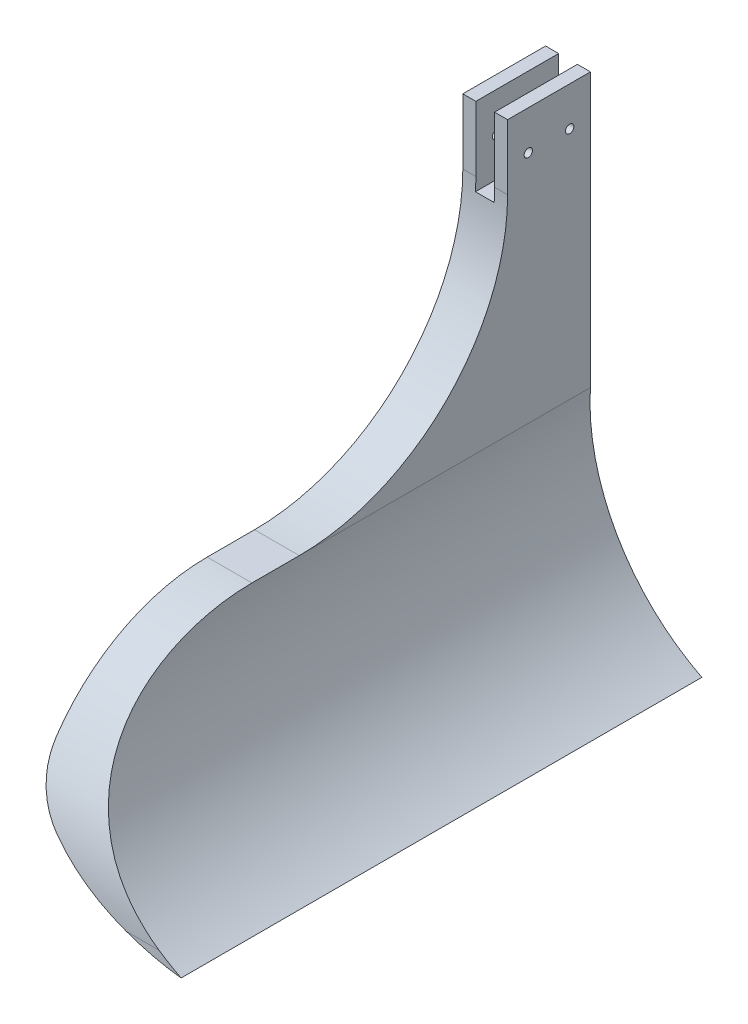
ISO-10303-21;
HEADER;
FILE_DESCRIPTION(('STEP AP214'),'2;1');
FILE_NAME('part.step','',(''),(''),'','','');
FILE_SCHEMA(('AUTOMOTIVE_DESIGN { 1 0 10303 214 1 1 1 1 }'));
ENDSEC;
DATA;
#1=APPLICATION_CONTEXT('core data for automotive mechanical design processes');
#2=APPLICATION_PROTOCOL_DEFINITION('international standard','automotive_design',2000,#1);
#3=PRODUCT_CONTEXT('',#1,'mechanical');
#4=PRODUCT('Part','Part','',(#3));
#5=PRODUCT_RELATED_PRODUCT_CATEGORY('part','',(#4));
#6=PRODUCT_DEFINITION_FORMATION('','',#4);
#7=PRODUCT_DEFINITION_CONTEXT('part definition',#1,'design');
#8=PRODUCT_DEFINITION('design','',#6,#7);
#9=PRODUCT_DEFINITION_SHAPE('','',#8);
#10=(LENGTH_UNIT() NAMED_UNIT(*) SI_UNIT(.MILLI.,.METRE.));
#11=(NAMED_UNIT(*) PLANE_ANGLE_UNIT() SI_UNIT($,.RADIAN.));
#12=(NAMED_UNIT(*) SI_UNIT($,.STERADIAN.) SOLID_ANGLE_UNIT());
#13=UNCERTAINTY_MEASURE_WITH_UNIT(LENGTH_MEASURE(1.E-05),#10,'distance_accuracy_value','');
#14=(GEOMETRIC_REPRESENTATION_CONTEXT(3) GLOBAL_UNCERTAINTY_ASSIGNED_CONTEXT((#13)) GLOBAL_UNIT_ASSIGNED_CONTEXT((#10,
#11,#12)) REPRESENTATION_CONTEXT('',''));
#15=CARTESIAN_POINT('',(0.,0.,0.));
#16=DIRECTION('',(0.,0.,1.));
#17=DIRECTION('',(1.,0.,0.));
#18=AXIS2_PLACEMENT_3D('',#15,#16,#17);
#19=CARTESIAN_POINT('',(0.,0.,31.8));
#20=DIRECTION('',(0.,0.,1.));
#21=DIRECTION('',(1.,0.,0.));
#22=AXIS2_PLACEMENT_3D('',#19,#20,#21);
#23=PLANE('',#22);
#24=DIRECTION('',(0.,1.,0.));
#25=VECTOR('',#24,1.);
#26=CARTESIAN_POINT('',(-30.,0.,31.8));
#27=LINE('',#26,#25);
#28=CARTESIAN_POINT('',(-30.,80.,31.8));
#29=VERTEX_POINT('',#28);
#30=CARTESIAN_POINT('',(-30.,105.,31.8));
#31=VERTEX_POINT('',#30);
#32=EDGE_CURVE('E232',#29,#31,#27,.T.);
#33=ORIENTED_EDGE('',*,*,#32,.F.);
#34=DIRECTION('',(1.,0.,0.));
#35=VECTOR('',#34,1.);
#36=CARTESIAN_POINT('',(-12.8,80.,31.8));
#37=LINE('',#36,#35);
#38=CARTESIAN_POINT('',(-25.,80.,31.8));
#39=VERTEX_POINT('',#38);
#40=EDGE_CURVE('E293',#29,#39,#37,.T.);
#41=ORIENTED_EDGE('',*,*,#40,.T.);
#42=DIRECTION('',(0.,-1.,0.));
#43=VECTOR('',#42,1.);
#44=CARTESIAN_POINT('',(-25.,0.,31.8));
#45=LINE('',#44,#43);
#46=CARTESIAN_POINT('',(-25.,105.,31.8));
#47=VERTEX_POINT('',#46);
#48=EDGE_CURVE('E244',#47,#39,#45,.T.);
#49=ORIENTED_EDGE('',*,*,#48,.F.);
#50=DIRECTION('',(1.,0.,0.));
#51=VECTOR('',#50,1.);
#52=CARTESIAN_POINT('',(0.,105.,31.8));
#53=LINE('',#52,#51);
#54=EDGE_CURVE('E247',#31,#47,#53,.T.);
#55=ORIENTED_EDGE('',*,*,#54,.F.);
#56=EDGE_LOOP('',(#33,#41,#49,#55));
#57=FACE_BOUND('',#56,.T.);
#58=ADVANCED_FACE('F41',(#57),#23,.T.);
#59=DIRECTION('',(0.,-1.,0.));
#60=VECTOR('',#59,1.);
#61=CARTESIAN_POINT('',(-17.8,0.,31.8));
#62=LINE('',#61,#60);
#63=CARTESIAN_POINT('',(-17.8,105.,31.8));
#64=VERTEX_POINT('',#63);
#65=CARTESIAN_POINT('',(-17.8,80.,31.8));
#66=VERTEX_POINT('',#65);
#67=EDGE_CURVE('E241',#64,#66,#62,.T.);
#68=ORIENTED_EDGE('',*,*,#67,.T.);
#69=DIRECTION('',(1.,0.,0.));
#70=VECTOR('',#69,1.);
#71=CARTESIAN_POINT('',(-12.8,80.,31.8));
#72=LINE('',#71,#70);
#73=CARTESIAN_POINT('',(-12.8,80.,31.8));
#74=VERTEX_POINT('',#73);
#75=EDGE_CURVE('E291',#66,#74,#72,.T.);
#76=ORIENTED_EDGE('',*,*,#75,.T.);
#77=DIRECTION('',(0.,-1.,0.));
#78=VECTOR('',#77,1.);
#79=CARTESIAN_POINT('',(-12.8,0.,31.8));
#80=LINE('',#79,#78);
#81=CARTESIAN_POINT('',(-12.8,105.,31.8));
#82=VERTEX_POINT('',#81);
#83=EDGE_CURVE('E234',#82,#74,#80,.T.);
#84=ORIENTED_EDGE('',*,*,#83,.F.);
#85=DIRECTION('',(1.,0.,0.));
#86=VECTOR('',#85,1.);
#87=CARTESIAN_POINT('',(0.,105.,31.8));
#88=LINE('',#87,#86);
#89=EDGE_CURVE('E238',#64,#82,#88,.T.);
#90=ORIENTED_EDGE('',*,*,#89,.F.);
#91=EDGE_LOOP('',(#68,#76,#84,#90));
#92=FACE_BOUND('',#91,.T.);
#93=ADVANCED_FACE('F378',(#92),#23,.T.);
#94=CARTESIAN_POINT('',(-30.,0.,31.8));
#95=DIRECTION('',(-1.,0.,0.));
#96=DIRECTION('',(0.,-1.,0.));
#97=AXIS2_PLACEMENT_3D('',#94,#95,#96);
#98=PLANE('',#97);
#99=CARTESIAN_POINT('',(-30.,90.,7.95));
#100=DIRECTION('',(1.,0.,0.));
#101=DIRECTION('',(0.,0.,1.));
#102=AXIS2_PLACEMENT_3D('',#99,#100,#101);
#103=CIRCLE('',#102,1.6);
#104=CARTESIAN_POINT('',(-30.,90.,9.55));
#105=VERTEX_POINT('',#104);
#106=EDGE_CURVE('E195',#105,#105,#103,.T.);
#107=ORIENTED_EDGE('',*,*,#106,.T.);
#108=EDGE_LOOP('',(#107));
#109=FACE_BOUND('',#108,.T.);
#110=CARTESIAN_POINT('',(-30.,90.,23.85));
#111=DIRECTION('',(1.,0.,0.));
#112=DIRECTION('',(0.,0.,-1.));
#113=AXIS2_PLACEMENT_3D('',#110,#111,#112);
#114=CIRCLE('',#113,1.6);
#115=CARTESIAN_POINT('',(-30.,90.,22.25));
#116=VERTEX_POINT('',#115);
#117=EDGE_CURVE('E183',#116,#116,#114,.T.);
#118=ORIENTED_EDGE('',*,*,#117,.T.);
#119=EDGE_LOOP('',(#118));
#120=FACE_BOUND('',#119,.T.);
#121=DIRECTION('',(0.,0.,1.));
#122=VECTOR('',#121,1.);
#123=CARTESIAN_POINT('',(-30.,-30.4818047918599,200.));
#124=LINE('',#123,#122);
#125=CARTESIAN_POINT('',(-30.,-30.4818047918599,0.));
#126=VERTEX_POINT('',#125);
#127=CARTESIAN_POINT('',(-30.,-30.4818047918599,187.778129491109));
#128=VERTEX_POINT('',#127);
#129=EDGE_CURVE('E316',#126,#128,#124,.T.);
#130=ORIENTED_EDGE('',*,*,#129,.T.);
#131=CARTESIAN_POINT('',(-30.0000000000001,-70.,130.));
#132=DIRECTION('',(-1.,0.,0.));
#133=DIRECTION('',(0.,-1.,0.));
#134=AXIS2_PLACEMENT_3D('',#131,#132,#133);
#135=CIRCLE('',#134,70.);
#136=CARTESIAN_POINT('',(-30.,0.,130.));
#137=VERTEX_POINT('',#136);
#138=EDGE_CURVE('E358',#128,#137,#135,.T.);
#139=ORIENTED_EDGE('',*,*,#138,.T.);
#140=DIRECTION('',(0.,0.,-1.));
#141=VECTOR('',#140,1.);
#142=CARTESIAN_POINT('',(-30.,0.,200.));
#143=LINE('',#142,#141);
#144=CARTESIAN_POINT('',(-30.,0.,111.8));
#145=VERTEX_POINT('',#144);
#146=EDGE_CURVE('E227',#137,#145,#143,.T.);
#147=ORIENTED_EDGE('',*,*,#146,.T.);
#148=CARTESIAN_POINT('',(-30.,80.,111.8));
#149=DIRECTION('',(-1.,0.,0.));
#150=DIRECTION('',(0.,-1.,0.));
#151=AXIS2_PLACEMENT_3D('',#148,#149,#150);
#152=CIRCLE('',#151,80.);
#153=EDGE_CURVE('E310',#145,#29,#152,.F.);
#154=ORIENTED_EDGE('',*,*,#153,.T.);
#155=ORIENTED_EDGE('',*,*,#32,.T.);
#156=DIRECTION('',(0.,0.,-1.));
#157=VECTOR('',#156,1.);
#158=CARTESIAN_POINT('',(-30.,105.,31.8));
#159=LINE('',#158,#157);
#160=CARTESIAN_POINT('',(-30.,105.,0.));
#161=VERTEX_POINT('',#160);
#162=EDGE_CURVE('E250',#31,#161,#159,.T.);
#163=ORIENTED_EDGE('',*,*,#162,.T.);
#164=DIRECTION('',(0.,1.,0.));
#165=VECTOR('',#164,1.);
#166=CARTESIAN_POINT('',(-30.,0.,0.));
#167=LINE('',#166,#165);
#168=EDGE_CURVE('E230',#126,#161,#167,.T.);
#169=ORIENTED_EDGE('',*,*,#168,.F.);
#170=EDGE_LOOP('',(#130,#139,#147,#154,#155,#163,#169));
#171=FACE_BOUND('',#170,.T.);
#172=ADVANCED_FACE('F343',(#109,#120,#171),#98,.T.);
#173=CARTESIAN_POINT('',(40.5018522884248,16.2007409153699,31.8));
#174=DIRECTION('',(0.,0.,-1.));
#175=DIRECTION('',(-1.,0.,0.));
#176=AXIS2_PLACEMENT_3D('',#173,#174,#175);
#177=CYLINDRICAL_SURFACE('',#176,91.803398874989);
#178=DIRECTION('',(0.,0.,-1.));
#179=VECTOR('',#178,1.);
#180=CARTESIAN_POINT('',(0.,-66.1853259054642,31.8));
#181=LINE('',#180,#179);
#182=CARTESIAN_POINT('',(0.,-66.1853259054642,160.893258265666));
#183=VERTEX_POINT('',#182);
#184=CARTESIAN_POINT('',(0.,-66.1853259054642,179.909808110345));
#185=VERTEX_POINT('',#184);
#186=EDGE_CURVE('E190',#183,#185,#181,.F.);
#187=ORIENTED_EDGE('',*,*,#186,.F.);
#188=CARTESIAN_POINT('',(40.5018522884248,16.2007409153699,160.893258265666));
#189=DIRECTION('',(0.,0.,-1.));
#190=DIRECTION('',(-1.,0.,0.));
#191=AXIS2_PLACEMENT_3D('',#188,#189,#190);
#192=CIRCLE('',#191,91.803398874989);
#193=CARTESIAN_POINT('',(-15.325484142754,-56.6770509831248,160.893258265666));
#194=VERTEX_POINT('',#193);
#195=EDGE_CURVE('E11',#183,#194,#192,.T.);
#196=ORIENTED_EDGE('',*,*,#195,.T.);
#197=CARTESIAN_POINT('',(40.5018522884248,16.2007409153699,15.1376744686769));
#198=DIRECTION('',(0.,0.894427190999916,0.447213595499958));
#199=DIRECTION('',(0.,0.447213595499958,-0.894427190999916));
#200=AXIS2_PLACEMENT_3D('',#197,#198,#199);
#201=ELLIPSE('',#200,205.278640450003,91.803398874989);
#202=EDGE_CURVE('E50',#194,#185,#201,.T.);
#203=ORIENTED_EDGE('',*,*,#202,.T.);
#204=EDGE_LOOP('',(#187,#196,#203));
#205=FACE_BOUND('',#204,.T.);
#206=CARTESIAN_POINT('',(40.5018522884248,16.2007409153699,21.8458784011762));
#207=DIRECTION('',(0.,-0.894427190999916,-0.447213595499958));
#208=DIRECTION('',(0.,0.447213595499958,-0.894427190999916));
#209=AXIS2_PLACEMENT_3D('',#206,#207,#208);
#210=ELLIPSE('',#209,205.278640450003,91.803398874989);
#211=CARTESIAN_POINT('',(0.,-66.1853259054642,186.618012042844));
#212=VERTEX_POINT('',#211);
#213=CARTESIAN_POINT('',(-17.4491488944943,-55.,164.247360231916));
#214=VERTEX_POINT('',#213);
#215=EDGE_CURVE('E452',#212,#214,#210,.T.);
#216=ORIENTED_EDGE('',*,*,#215,.T.);
#217=DIRECTION('',(0.,0.,-1.));
#218=VECTOR('',#217,1.);
#219=CARTESIAN_POINT('',(-17.4491488944943,-55.,31.8));
#220=LINE('',#219,#218);
#221=CARTESIAN_POINT('',(-17.4491488944943,-55.,190.893258265666));
#222=VERTEX_POINT('',#221);
#223=EDGE_CURVE('E457',#214,#222,#220,.F.);
#224=ORIENTED_EDGE('',*,*,#223,.T.);
#225=CARTESIAN_POINT('',(40.5018522884248,16.2007409153699,190.893258265666));
#226=DIRECTION('',(0.,0.,1.));
#227=DIRECTION('',(1.,0.,0.));
#228=AXIS2_PLACEMENT_3D('',#225,#226,#227);
#229=CIRCLE('',#228,91.803398874989);
#230=CARTESIAN_POINT('',(0.,-66.1853259054642,190.893258265666));
#231=VERTEX_POINT('',#230);
#232=EDGE_CURVE('E447',#222,#231,#229,.T.);
#233=ORIENTED_EDGE('',*,*,#232,.T.);
#234=DIRECTION('',(0.,0.,-1.));
#235=VECTOR('',#234,1.);
#236=CARTESIAN_POINT('',(0.,-66.1853259054642,31.8));
#237=LINE('',#236,#235);
#238=EDGE_CURVE('E445',#231,#212,#237,.T.);
#239=ORIENTED_EDGE('',*,*,#238,.T.);
#240=EDGE_LOOP('',(#216,#224,#233,#239));
#241=FACE_BOUND('',#240,.T.);
#242=CARTESIAN_POINT('',(40.5018522884248,16.2007409153699,200.));
#243=DIRECTION('',(0.,0.,1.));
#244=DIRECTION('',(1.,0.,0.));
#245=AXIS2_PLACEMENT_3D('',#242,#243,#244);
#246=CIRCLE('',#245,91.803398874989);
#247=CARTESIAN_POINT('',(8.92185370321916,-70.,200.));
#248=VERTEX_POINT('',#247);
#249=CARTESIAN_POINT('',(30.,-75.,200.));
#250=VERTEX_POINT('',#249);
#251=EDGE_CURVE('E225',#248,#250,#246,.T.);
#252=ORIENTED_EDGE('',*,*,#251,.F.);
#253=CARTESIAN_POINT('',(8.92185370321916,-70.,200.));
#254=CARTESIAN_POINT('',(8.26411347929146,-69.7590340717941,199.999996557121));
#255=CARTESIAN_POINT('',(7.60915491631928,-69.5105483306834,199.998756105011));
#256=CARTESIAN_POINT('',(6.3051005385999,-68.9986541052959,199.993306250773));
#257=CARTESIAN_POINT('',(5.65600478485099,-68.7352454659641,199.989096817792));
#258=CARTESIAN_POINT('',(3.71796967445498,-67.9228133991998,199.971272558723));
#259=CARTESIAN_POINT('',(2.43829432753717,-67.3515881678083,199.952461754739));
#260=CARTESIAN_POINT('',(-0.0808646972158559,-66.1572063567584,199.896972592429));
#261=CARTESIAN_POINT('',(-1.32061868494865,-65.5346107836442,199.860470339025));
#262=CARTESIAN_POINT('',(-3.77000210090307,-64.2342601642477,199.765186323071));
#263=CARTESIAN_POINT('',(-4.9796318632748,-63.556505730166,199.70640480777));
#264=CARTESIAN_POINT('',(-7.36616863705288,-62.1474395501762,199.561763915276));
#265=CARTESIAN_POINT('',(-8.54306534212335,-61.416111193555,199.475896112403));
#266=CARTESIAN_POINT('',(-10.8605794110915,-59.9023483642921,199.272077014389));
#267=CARTESIAN_POINT('',(-12.0011988308855,-59.1199167954588,199.154127541001));
#268=CARTESIAN_POINT('',(-14.2540933252477,-57.4986133623688,198.87958909915));
#269=CARTESIAN_POINT('',(-15.3659815239629,-56.6592638878951,198.722633109577));
#270=CARTESIAN_POINT('',(-17.0011786800007,-55.3656549531663,198.454582993224));
#271=CARTESIAN_POINT('',(-17.5408960161882,-54.9286090246824,198.35977765231));
#272=CARTESIAN_POINT('',(-18.6090291205779,-54.0434682881892,198.158602112912));
#273=CARTESIAN_POINT('',(-19.1374444600317,-53.5953730624011,198.05223147662));
#274=CARTESIAN_POINT('',(-19.6600120829999,-53.1419884825606,197.939733938822));
#275=B_SPLINE_CURVE_WITH_KNOTS('',3,(#253,#254,#255,#256,#257,#258,#259,#260,#261,#262,#263,
#264,#265,#266,#267,#268,#269,#270,#271,#272,#273,#274),.UNSPECIFIED.,.F.,.F.,(4,2,2,2,2,2,2,2,
2,2,4),(0.,2.10137287499703,4.20276758812977,8.40559486633036,12.5674196708921,16.7291982902267,
20.8922727846682,25.0551109285769,29.2587084386886,31.3612368974471,33.463844975971),.UNSPECIFIED.);
#276=CARTESIAN_POINT('',(-19.660012083,-53.1419884825606,197.939733938822));
#277=VERTEX_POINT('',#276);
#278=EDGE_CURVE('E346',#248,#277,#275,.T.);
#279=ORIENTED_EDGE('',*,*,#278,.T.);
#280=DIRECTION('',(0.,0.,-1.));
#281=VECTOR('',#280,1.);
#282=CARTESIAN_POINT('',(-19.660012083,-53.1419884825606,31.8));
#283=LINE('',#282,#281);
#284=CARTESIAN_POINT('',(-19.660012083,-53.1419884825606,0.));
#285=VERTEX_POINT('',#284);
#286=EDGE_CURVE('E312',#277,#285,#283,.T.);
#287=ORIENTED_EDGE('',*,*,#286,.T.);
#288=CARTESIAN_POINT('',(40.5018522884248,16.2007409153699,0.));
#289=DIRECTION('',(0.,0.,1.));
#290=DIRECTION('',(1.,0.,0.));
#291=AXIS2_PLACEMENT_3D('',#288,#289,#290);
#292=CIRCLE('',#291,91.803398874989);
#293=CARTESIAN_POINT('',(30.,-75.,0.));
#294=VERTEX_POINT('',#293);
#295=EDGE_CURVE('E252',#285,#294,#292,.T.);
#296=ORIENTED_EDGE('',*,*,#295,.T.);
#297=DIRECTION('',(0.,0.,-1.));
#298=VECTOR('',#297,1.);
#299=CARTESIAN_POINT('',(30.,-75.,31.8));
#300=LINE('',#299,#298);
#301=EDGE_CURVE('E288',#250,#294,#300,.T.);
#302=ORIENTED_EDGE('',*,*,#301,.F.);
#303=EDGE_LOOP('',(#252,#279,#287,#296,#302));
#304=FACE_BOUND('',#303,.T.);
#305=ADVANCED_FACE('F337',(#205,#241,#304),#177,.T.);
#306=CARTESIAN_POINT('',(65.6980576649736,-4.91604175918838,31.8));
#307=DIRECTION('',(0.,0.,-1.));
#308=DIRECTION('',(-1.,0.,0.));
#309=AXIS2_PLACEMENT_3D('',#306,#307,#308);
#310=CYLINDRICAL_SURFACE('',#309,78.6518437403193);
#311=DIRECTION('',(0.,0.,-1.));
#312=VECTOR('',#311,1.);
#313=CARTESIAN_POINT('',(-12.8,0.,200.));
#314=LINE('',#313,#312);
#315=CARTESIAN_POINT('',(-12.8,0.,130.));
#316=VERTEX_POINT('',#315);
#317=CARTESIAN_POINT('',(-12.8,0.,111.8));
#318=VERTEX_POINT('',#317);
#319=EDGE_CURVE('E228',#316,#318,#314,.T.);
#320=ORIENTED_EDGE('',*,*,#319,.F.);
#321=CARTESIAN_POINT('',(-12.8,0.,130.));
#322=CARTESIAN_POINT('',(-12.7999642052155,1.32345455669019E-05,130.98094729135));
#323=CARTESIAN_POINT('',(-12.8012901008779,-0.0206193070886854,131.961892960559));
#324=CARTESIAN_POINT('',(-12.8064078399143,-0.10308054150943,133.922039054772));
#325=CARTESIAN_POINT('',(-12.8101996682476,-0.164908983029099,134.901239490383));
#326=CARTESIAN_POINT('',(-12.8199915316035,-0.329661340319642,136.856102501738));
#327=CARTESIAN_POINT('',(-12.8259914251348,-0.432582622927384,137.831765300127));
#328=CARTESIAN_POINT('',(-12.8396924430125,-0.679333026045934,139.777891860139));
#329=CARTESIAN_POINT('',(-12.8473935675724,-0.823162151692727,140.74835562111));
#330=CARTESIAN_POINT('',(-12.8638184684743,-1.15158193864885,142.683006513837));
#331=CARTESIAN_POINT('',(-12.8725429113507,-1.33619923711572,143.647189118037));
#332=CARTESIAN_POINT('',(-12.8901362015666,-1.74581581673852,145.566940995437));
#333=CARTESIAN_POINT('',(-12.8990050495374,-1.97081527447156,146.522510230956));
#334=CARTESIAN_POINT('',(-12.9158367242898,-2.46079960482181,148.423347259794));
#335=CARTESIAN_POINT('',(-12.9237995534837,-2.72578437097588,149.368615080534));
#336=CARTESIAN_POINT('',(-12.9376006330794,-3.29527453695544,151.247186571631));
#337=CARTESIAN_POINT('',(-12.9434388834784,-3.59977993683442,152.18049024197));
#338=CARTESIAN_POINT('',(-12.9516171100602,-4.24798538026195,154.034083960523));
#339=CARTESIAN_POINT('',(-12.9539548115935,-4.59171075291293,154.954365162439));
#340=CARTESIAN_POINT('',(-12.953598374494,-5.31761526962595,156.779729437704));
#341=CARTESIAN_POINT('',(-12.9509037973953,-5.69979776173786,157.684811179779));
#342=CARTESIAN_POINT('',(-12.9388198943983,-6.50187184626557,159.477997962379));
#343=CARTESIAN_POINT('',(-12.9294309972237,-6.92176102233105,160.366104086332));
#344=CARTESIAN_POINT('',(-12.9021725554772,-7.79852359327602,162.123838410132));
#345=CARTESIAN_POINT('',(-12.884302272619,-8.25540020495931,162.993464994487));
#346=CARTESIAN_POINT('',(-12.8381948363613,-9.20503309027219,164.712181682612));
#347=CARTESIAN_POINT('',(-12.8099617614731,-9.69777518714552,165.561279725911));
#348=CARTESIAN_POINT('',(-12.7411414527228,-10.7182908646927,167.237640193839));
#349=CARTESIAN_POINT('',(-12.7005543474723,-11.2460640806306,168.064902845689));
#350=CARTESIAN_POINT('',(-12.6049609531509,-12.3355304447598,169.695979780155));
#351=CARTESIAN_POINT('',(-12.5499541463491,-12.8972248103128,170.499793219688));
#352=CARTESIAN_POINT('',(-12.4234087432706,-14.0531640085298,172.082198835525));
#353=CARTESIAN_POINT('',(-12.3518720097676,-14.6474051677109,172.860793842453));
#354=CARTESIAN_POINT('',(-12.1920437722545,-15.8524554175663,174.372915322861));
#355=CARTESIAN_POINT('',(-12.1041934550096,-16.4625293539679,175.107074148351));
#356=CARTESIAN_POINT('',(-11.9086905829031,-17.710733480593,176.548267763277));
#357=CARTESIAN_POINT('',(-11.8010404654614,-18.348860210076,177.255305878427));
#358=CARTESIAN_POINT('',(-11.5639356571324,-19.6515506920616,178.64090793562));
#359=CARTESIAN_POINT('',(-11.4344793993949,-20.3161163416736,179.319469827164));
#360=CARTESIAN_POINT('',(-11.1518321938311,-21.6696962583781,180.646619764897));
#361=CARTESIAN_POINT('',(-10.9986412898397,-22.3587104803153,181.295207866442));
#362=CARTESIAN_POINT('',(-10.6668499143928,-23.7582831361081,182.560370286155));
#363=CARTESIAN_POINT('',(-10.4882765034753,-24.4688179997998,183.176977755734));
#364=CARTESIAN_POINT('',(-10.1038723756982,-25.9097528843875,184.377656933986));
#365=CARTESIAN_POINT('',(-9.89804147436741,-26.6401530396997,184.961728422429));
#366=CARTESIAN_POINT('',(-9.45758268403362,-28.1181270265323,186.096135696885));
#367=CARTESIAN_POINT('',(-9.22295823794597,-28.8656987961282,186.646475504503));
#368=CARTESIAN_POINT('',(-8.72351918589893,-30.3752916580421,187.712531037096));
#369=CARTESIAN_POINT('',(-8.4587055543141,-31.137312283353,188.228247878695));
#370=CARTESIAN_POINT('',(-7.93001931109923,-32.584472773664,189.167003233628));
#371=CARTESIAN_POINT('',(-7.669544319307,-33.268370169632,189.593877807661));
#372=CARTESIAN_POINT('',(-7.12341517144908,-34.6430082659281,190.41958244135));
#373=CARTESIAN_POINT('',(-6.83776131712554,-35.3337488841593,190.818412836983));
#374=CARTESIAN_POINT('',(-6.24082257612842,-36.7198050399644,191.587798058142));
#375=CARTESIAN_POINT('',(-5.92953968663455,-37.4151202171811,191.958355082584));
#376=CARTESIAN_POINT('',(-5.28101495200494,-38.8081357225157,192.671203678839));
#377=CARTESIAN_POINT('',(-4.94377295444956,-39.5058360646151,193.013495084667));
#378=CARTESIAN_POINT('',(-4.24327025766634,-40.9012120614288,193.669890120222));
#379=CARTESIAN_POINT('',(-3.88001513011249,-41.5988876895975,193.98399975384));
#380=CARTESIAN_POINT('',(-3.12745058026877,-42.9921340918443,194.584445569177));
#381=CARTESIAN_POINT('',(-2.73814107478683,-43.6877048591942,194.870781662207));
#382=CARTESIAN_POINT('',(-1.93366641804871,-45.0745406619204,195.416180525879));
#383=CARTESIAN_POINT('',(-1.51850190119297,-45.7658058024858,195.675243965286));
#384=CARTESIAN_POINT('',(-0.662642720439212,-47.141940330372,196.166781298714));
#385=CARTESIAN_POINT('',(-0.221948330836136,-47.8268097863169,196.399255478333));
#386=CARTESIAN_POINT('',(0.656477467979024,-49.1460540171751,196.824869596594));
#387=CARTESIAN_POINT('',(1.09270702314447,-49.7809324562113,197.01955289668));
#388=CARTESIAN_POINT('',(1.9867943613766,-51.0417916830196,197.38707289288));
#389=CARTESIAN_POINT('',(2.44465384188241,-51.6677717674492,197.55990787049));
#390=CARTESIAN_POINT('',(3.38139036084645,-52.9092711531631,197.884597783291));
#391=CARTESIAN_POINT('',(3.86026549470647,-53.5247913954127,198.036454614529));
#392=CARTESIAN_POINT('',(4.8384733175493,-54.7440936289768,198.320196643952));
#393=CARTESIAN_POINT('',(5.33780769178084,-55.3478746472546,198.452080192699));
#394=CARTESIAN_POINT('',(6.86598372777234,-57.1402132667528,198.819425881448));
#395=CARTESIAN_POINT('',(7.92470865160013,-58.3093819594017,199.026484181363));
#396=CARTESIAN_POINT('',(10.1156727859152,-60.5865713259255,199.373729735374));
#397=CARTESIAN_POINT('',(11.2479006604402,-61.6946013803495,199.51392727334));
#398=CARTESIAN_POINT('',(13.1281865319347,-63.4264237151067,199.693798922025));
#399=CARTESIAN_POINT('',(13.855125488556,-64.0715004017586,199.751374756066));
#400=CARTESIAN_POINT('',(15.3330564455398,-65.334779522204,199.847239474091));
#401=CARTESIAN_POINT('',(16.0840445250149,-65.952986298424,199.885531485188));
#402=CARTESIAN_POINT('',(17.6063569047051,-67.159442679523,199.944942190882));
#403=CARTESIAN_POINT('',(18.377607137825,-67.7477831586652,199.966116322529));
#404=CARTESIAN_POINT('',(19.9415770152844,-68.8957153735764,199.993641814773));
#405=CARTESIAN_POINT('',(20.7342984535689,-69.4553046957657,199.999991932918));
#406=CARTESIAN_POINT('',(21.5370918302017,-70.,200.));
#407=B_SPLINE_CURVE_WITH_KNOTS('',3,(#321,#322,#323,#324,#325,#326,#327,#328,#329,#330,#331,
#332,#333,#334,#335,#336,#337,#338,#339,#340,#341,#342,#343,#344,#345,#346,#347,#348,#349,#350,
#351,#352,#353,#354,#355,#356,#357,#358,#359,#360,#361,#362,#363,#364,#365,#366,#367,#368,#369,
#370,#371,#372,#373,#374,#375,#376,#377,#378,#379,#380,#381,#382,#383,#384,#385,#386,#387,#388,
#389,#390,#391,#392,#393,#394,#395,#396,#397,#398,#399,#400,#401,#402,#403,#404,#405,#406),
.UNSPECIFIED.,.F.,.F.,(4,2,2,2,2,2,2,2,2,2,2,2,2,2,2,2,2,2,2,2,2,2,2,2,2,2,2,2,2,2,2,2,2,2,2,2,
2,2,2,2,2,2,4),(0.,2.94262158965359,5.88522523149164,8.82764034627742,11.7700558304839,
14.7143986010373,17.6587542464902,20.6031020525685,23.5474498626326,26.4937100749431,
29.4402270088876,32.3865552563032,35.3331400222494,38.2785663343969,41.2239619842527,
44.1694634013128,47.1146330486765,49.9894298934195,52.8638730778792,55.7385228896609,
58.6131673923732,61.4847698800872,64.3563918029919,67.2276706929036,70.0988569367424,
72.6396807618396,75.1804741419777,77.7210697141669,80.2616802046734,82.8017481477324,
85.3418242016574,87.881837954664,90.4218244226245,92.8047485940591,95.1878600805122,
97.5707560355112,99.9538486682678,104.721504243682,109.488426268181,112.408419445765,
115.327938957314,118.23796516056,121.148235254614),.UNSPECIFIED.);
#408=CARTESIAN_POINT('',(21.5370918302017,-70.,200.));
#409=VERTEX_POINT('',#408);
#410=EDGE_CURVE('E322',#316,#409,#407,.T.);
#411=ORIENTED_EDGE('',*,*,#410,.T.);
#412=CARTESIAN_POINT('',(65.6980576649736,-4.91604175918838,200.));
#413=DIRECTION('',(0.,0.,1.));
#414=DIRECTION('',(1.,0.,0.));
#415=AXIS2_PLACEMENT_3D('',#412,#413,#414);
#416=CIRCLE('',#415,78.6518437403193);
#417=EDGE_CURVE('E222',#409,#250,#416,.T.);
#418=ORIENTED_EDGE('',*,*,#417,.T.);
#419=ORIENTED_EDGE('',*,*,#301,.T.);
#420=CARTESIAN_POINT('',(65.6980576649736,-4.91604175918838,0.));
#421=DIRECTION('',(0.,0.,1.));
#422=DIRECTION('',(1.,0.,0.));
#423=AXIS2_PLACEMENT_3D('',#420,#421,#422);
#424=CIRCLE('',#423,78.6518437403193);
#425=CARTESIAN_POINT('',(-12.8,0.,0.));
#426=VERTEX_POINT('',#425);
#427=EDGE_CURVE('E254',#426,#294,#424,.T.);
#428=ORIENTED_EDGE('',*,*,#427,.F.);
#429=DIRECTION('',(0.,0.,-1.));
#430=VECTOR('',#429,1.);
#431=CARTESIAN_POINT('',(-12.8,0.,31.8));
#432=LINE('',#431,#430);
#433=EDGE_CURVE('E286',#318,#426,#432,.T.);
#434=ORIENTED_EDGE('',*,*,#433,.F.);
#435=EDGE_LOOP('',(#320,#411,#418,#419,#428,#434));
#436=FACE_BOUND('',#435,.T.);
#437=ADVANCED_FACE('F331',(#436),#310,.F.);
#438=CARTESIAN_POINT('',(-12.8,0.,31.8));
#439=DIRECTION('',(1.,0.,0.));
#440=DIRECTION('',(0.,1.,0.));
#441=AXIS2_PLACEMENT_3D('',#438,#439,#440);
#442=PLANE('',#441);
#443=CARTESIAN_POINT('',(-12.8,90.,7.95));
#444=DIRECTION('',(1.,0.,0.));
#445=DIRECTION('',(0.,1.,0.));
#446=AXIS2_PLACEMENT_3D('',#443,#444,#445);
#447=CIRCLE('',#446,1.6);
#448=CARTESIAN_POINT('',(-12.8,91.6,7.95));
#449=VERTEX_POINT('',#448);
#450=EDGE_CURVE('E219',#449,#449,#447,.T.);
#451=ORIENTED_EDGE('',*,*,#450,.F.);
#452=EDGE_LOOP('',(#451));
#453=FACE_BOUND('',#452,.T.);
#454=CARTESIAN_POINT('',(-12.8,90.,23.85));
#455=DIRECTION('',(1.,0.,0.));
#456=DIRECTION('',(0.,1.,0.));
#457=AXIS2_PLACEMENT_3D('',#454,#455,#456);
#458=CIRCLE('',#457,1.6);
#459=CARTESIAN_POINT('',(-12.8,91.6,23.85));
#460=VERTEX_POINT('',#459);
#461=EDGE_CURVE('E212',#460,#460,#458,.T.);
#462=ORIENTED_EDGE('',*,*,#461,.F.);
#463=EDGE_LOOP('',(#462));
#464=FACE_BOUND('',#463,.T.);
#465=DIRECTION('',(0.,-1.,0.));
#466=VECTOR('',#465,1.);
#467=CARTESIAN_POINT('',(-12.8,0.,0.));
#468=LINE('',#467,#466);
#469=CARTESIAN_POINT('',(-12.8,105.,0.));
#470=VERTEX_POINT('',#469);
#471=EDGE_CURVE('E257',#470,#426,#468,.T.);
#472=ORIENTED_EDGE('',*,*,#471,.F.);
#473=DIRECTION('',(0.,0.,-1.));
#474=VECTOR('',#473,1.);
#475=CARTESIAN_POINT('',(-12.8,105.,31.8));
#476=LINE('',#475,#474);
#477=EDGE_CURVE('E284',#82,#470,#476,.T.);
#478=ORIENTED_EDGE('',*,*,#477,.F.);
#479=ORIENTED_EDGE('',*,*,#83,.T.);
#480=CARTESIAN_POINT('',(-12.8,80.,111.8));
#481=DIRECTION('',(1.,0.,0.));
#482=DIRECTION('',(0.,1.,0.));
#483=AXIS2_PLACEMENT_3D('',#480,#481,#482);
#484=CIRCLE('',#483,80.);
#485=EDGE_CURVE('E307',#74,#318,#484,.F.);
#486=ORIENTED_EDGE('',*,*,#485,.T.);
#487=ORIENTED_EDGE('',*,*,#433,.T.);
#488=EDGE_LOOP('',(#472,#478,#479,#486,#487));
#489=FACE_BOUND('',#488,.T.);
#490=ADVANCED_FACE('F336',(#453,#464,#489),#442,.T.);
#491=CARTESIAN_POINT('',(0.,105.,31.8));
#492=DIRECTION('',(0.,1.,0.));
#493=DIRECTION('',(0.,0.,1.));
#494=AXIS2_PLACEMENT_3D('',#491,#492,#493);
#495=PLANE('',#494);
#496=DIRECTION('',(1.,0.,0.));
#497=VECTOR('',#496,1.);
#498=CARTESIAN_POINT('',(0.,105.,0.));
#499=LINE('',#498,#497);
#500=CARTESIAN_POINT('',(-17.8,105.,0.));
#501=VERTEX_POINT('',#500);
#502=EDGE_CURVE('E260',#501,#470,#499,.T.);
#503=ORIENTED_EDGE('',*,*,#502,.F.);
#504=DIRECTION('',(0.,0.,-1.));
#505=VECTOR('',#504,1.);
#506=CARTESIAN_POINT('',(-17.8,105.,31.8));
#507=LINE('',#506,#505);
#508=EDGE_CURVE('E282',#64,#501,#507,.T.);
#509=ORIENTED_EDGE('',*,*,#508,.F.);
#510=ORIENTED_EDGE('',*,*,#89,.T.);
#511=ORIENTED_EDGE('',*,*,#477,.T.);
#512=EDGE_LOOP('',(#503,#509,#510,#511));
#513=FACE_BOUND('',#512,.T.);
#514=ADVANCED_FACE('F404',(#513),#495,.T.);
#515=CARTESIAN_POINT('',(-17.8,0.,31.8));
#516=DIRECTION('',(1.,0.,0.));
#517=DIRECTION('',(0.,1.,0.));
#518=AXIS2_PLACEMENT_3D('',#515,#516,#517);
#519=PLANE('',#518);
#520=CARTESIAN_POINT('',(-17.8,90.,7.95));
#521=DIRECTION('',(1.,0.,0.));
#522=DIRECTION('',(0.,1.,0.));
#523=AXIS2_PLACEMENT_3D('',#520,#521,#522);
#524=CIRCLE('',#523,1.6);
#525=CARTESIAN_POINT('',(-17.8,91.6,7.95));
#526=VERTEX_POINT('',#525);
#527=EDGE_CURVE('E216',#526,#526,#524,.T.);
#528=ORIENTED_EDGE('',*,*,#527,.T.);
#529=EDGE_LOOP('',(#528));
#530=FACE_BOUND('',#529,.T.);
#531=CARTESIAN_POINT('',(-17.8,90.,23.85));
#532=DIRECTION('',(1.,0.,0.));
#533=DIRECTION('',(0.,1.,0.));
#534=AXIS2_PLACEMENT_3D('',#531,#532,#533);
#535=CIRCLE('',#534,1.6);
#536=CARTESIAN_POINT('',(-17.8,91.6,23.85));
#537=VERTEX_POINT('',#536);
#538=EDGE_CURVE('E209',#537,#537,#535,.T.);
#539=ORIENTED_EDGE('',*,*,#538,.T.);
#540=EDGE_LOOP('',(#539));
#541=FACE_BOUND('',#540,.T.);
#542=DIRECTION('',(0.,-1.,0.));
#543=VECTOR('',#542,1.);
#544=CARTESIAN_POINT('',(-17.8,0.,0.));
#545=LINE('',#544,#543);
#546=CARTESIAN_POINT('',(-17.8,75.,0.));
#547=VERTEX_POINT('',#546);
#548=EDGE_CURVE('E263',#501,#547,#545,.T.);
#549=ORIENTED_EDGE('',*,*,#548,.T.);
#550=DIRECTION('',(0.,0.,-1.));
#551=VECTOR('',#550,1.);
#552=CARTESIAN_POINT('',(-17.8,75.,31.8));
#553=LINE('',#552,#551);
#554=CARTESIAN_POINT('',(-17.8,75.,31.9564028866435));
#555=VERTEX_POINT('',#554);
#556=EDGE_CURVE('E280',#555,#547,#553,.T.);
#557=ORIENTED_EDGE('',*,*,#556,.F.);
#558=CARTESIAN_POINT('',(-17.8,80.,111.8));
#559=DIRECTION('',(1.,0.,0.));
#560=DIRECTION('',(0.,1.,0.));
#561=AXIS2_PLACEMENT_3D('',#558,#559,#560);
#562=CIRCLE('',#561,80.);
#563=EDGE_CURVE('E305',#555,#66,#562,.T.);
#564=ORIENTED_EDGE('',*,*,#563,.T.);
#565=ORIENTED_EDGE('',*,*,#67,.F.);
#566=ORIENTED_EDGE('',*,*,#508,.T.);
#567=EDGE_LOOP('',(#549,#557,#564,#565,#566));
#568=FACE_BOUND('',#567,.T.);
#569=ADVANCED_FACE('F401',(#530,#541,#568),#519,.F.);
#570=CARTESIAN_POINT('',(0.,75.,31.8));
#571=DIRECTION('',(0.,1.,0.));
#572=DIRECTION('',(0.,0.,1.));
#573=AXIS2_PLACEMENT_3D('',#570,#571,#572);
#574=PLANE('',#573);
#575=DIRECTION('',(1.,0.,0.));
#576=VECTOR('',#575,1.);
#577=CARTESIAN_POINT('',(0.,75.,0.));
#578=LINE('',#577,#576);
#579=CARTESIAN_POINT('',(-25.,75.,0.));
#580=VERTEX_POINT('',#579);
#581=EDGE_CURVE('E266',#580,#547,#578,.T.);
#582=ORIENTED_EDGE('',*,*,#581,.F.);
#583=DIRECTION('',(0.,0.,-1.));
#584=VECTOR('',#583,1.);
#585=CARTESIAN_POINT('',(-25.,75.,31.8));
#586=LINE('',#585,#584);
#587=CARTESIAN_POINT('',(-25.,75.,31.9564028866435));
#588=VERTEX_POINT('',#587);
#589=EDGE_CURVE('E278',#588,#580,#586,.T.);
#590=ORIENTED_EDGE('',*,*,#589,.F.);
#591=DIRECTION('',(-1.,0.,0.));
#592=VECTOR('',#591,1.);
#593=CARTESIAN_POINT('',(-25.,75.,31.9564028866435));
#594=LINE('',#593,#592);
#595=EDGE_CURVE('E302',#588,#555,#594,.F.);
#596=ORIENTED_EDGE('',*,*,#595,.T.);
#597=ORIENTED_EDGE('',*,*,#556,.T.);
#598=EDGE_LOOP('',(#582,#590,#596,#597));
#599=FACE_BOUND('',#598,.T.);
#600=ADVANCED_FACE('F398',(#599),#574,.T.);
#601=CARTESIAN_POINT('',(-25.,0.,31.8));
#602=DIRECTION('',(1.,0.,0.));
#603=DIRECTION('',(0.,0.,-1.));
#604=AXIS2_PLACEMENT_3D('',#601,#602,#603);
#605=PLANE('',#604);
#606=CARTESIAN_POINT('',(-25.,90.,7.95));
#607=DIRECTION('',(1.,0.,0.));
#608=DIRECTION('',(0.,0.,-1.));
#609=AXIS2_PLACEMENT_3D('',#606,#607,#608);
#610=CIRCLE('',#609,1.6);
#611=CARTESIAN_POINT('',(-25.,90.,6.35));
#612=VERTEX_POINT('',#611);
#613=EDGE_CURVE('E215',#612,#612,#610,.T.);
#614=ORIENTED_EDGE('',*,*,#613,.F.);
#615=EDGE_LOOP('',(#614));
#616=FACE_BOUND('',#615,.T.);
#617=CARTESIAN_POINT('',(-25.,90.,23.85));
#618=DIRECTION('',(1.,0.,0.));
#619=DIRECTION('',(0.,0.,-1.));
#620=AXIS2_PLACEMENT_3D('',#617,#618,#619);
#621=CIRCLE('',#620,1.6);
#622=CARTESIAN_POINT('',(-25.,90.,22.25));
#623=VERTEX_POINT('',#622);
#624=EDGE_CURVE('E207',#623,#623,#621,.T.);
#625=ORIENTED_EDGE('',*,*,#624,.F.);
#626=EDGE_LOOP('',(#625));
#627=FACE_BOUND('',#626,.T.);
#628=DIRECTION('',(0.,-1.,0.));
#629=VECTOR('',#628,1.);
#630=CARTESIAN_POINT('',(-25.,0.,0.));
#631=LINE('',#630,#629);
#632=CARTESIAN_POINT('',(-25.,105.,0.));
#633=VERTEX_POINT('',#632);
#634=EDGE_CURVE('E269',#633,#580,#631,.T.);
#635=ORIENTED_EDGE('',*,*,#634,.F.);
#636=DIRECTION('',(0.,0.,-1.));
#637=VECTOR('',#636,1.);
#638=CARTESIAN_POINT('',(-25.,105.,31.8));
#639=LINE('',#638,#637);
#640=EDGE_CURVE('E276',#47,#633,#639,.T.);
#641=ORIENTED_EDGE('',*,*,#640,.F.);
#642=ORIENTED_EDGE('',*,*,#48,.T.);
#643=CARTESIAN_POINT('',(-25.,80.,111.8));
#644=DIRECTION('',(1.,0.,0.));
#645=DIRECTION('',(0.,0.,-1.));
#646=AXIS2_PLACEMENT_3D('',#643,#644,#645);
#647=CIRCLE('',#646,80.);
#648=EDGE_CURVE('E299',#39,#588,#647,.F.);
#649=ORIENTED_EDGE('',*,*,#648,.T.);
#650=ORIENTED_EDGE('',*,*,#589,.T.);
#651=EDGE_LOOP('',(#635,#641,#642,#649,#650));
#652=FACE_BOUND('',#651,.T.);
#653=ADVANCED_FACE('F394',(#616,#627,#652),#605,.T.);
#654=CARTESIAN_POINT('',(0.,105.,31.8));
#655=DIRECTION('',(0.,1.,0.));
#656=DIRECTION('',(0.,0.,1.));
#657=AXIS2_PLACEMENT_3D('',#654,#655,#656);
#658=PLANE('',#657);
#659=DIRECTION('',(1.,0.,0.));
#660=VECTOR('',#659,1.);
#661=CARTESIAN_POINT('',(0.,105.,0.));
#662=LINE('',#661,#660);
#663=EDGE_CURVE('E235',#161,#633,#662,.T.);
#664=ORIENTED_EDGE('',*,*,#663,.F.);
#665=ORIENTED_EDGE('',*,*,#162,.F.);
#666=ORIENTED_EDGE('',*,*,#54,.T.);
#667=ORIENTED_EDGE('',*,*,#640,.T.);
#668=EDGE_LOOP('',(#664,#665,#666,#667));
#669=FACE_BOUND('',#668,.T.);
#670=ADVANCED_FACE('F391',(#669),#658,.T.);
#671=CARTESIAN_POINT('',(0.,0.,0.));
#672=DIRECTION('',(0.,0.,1.));
#673=DIRECTION('',(1.,0.,0.));
#674=AXIS2_PLACEMENT_3D('',#671,#672,#673);
#675=PLANE('',#674);
#676=ORIENTED_EDGE('',*,*,#295,.F.);
#677=CARTESIAN_POINT('',(0.,-30.4818047918599,0.));
#678=DIRECTION('',(0.,0.,1.));
#679=DIRECTION('',(1.,0.,0.));
#680=AXIS2_PLACEMENT_3D('',#677,#678,#679);
#681=CIRCLE('',#680,30.);
#682=EDGE_CURVE('E314',#285,#126,#681,.F.);
#683=ORIENTED_EDGE('',*,*,#682,.T.);
#684=ORIENTED_EDGE('',*,*,#168,.T.);
#685=ORIENTED_EDGE('',*,*,#663,.T.);
#686=ORIENTED_EDGE('',*,*,#634,.T.);
#687=ORIENTED_EDGE('',*,*,#581,.T.);
#688=ORIENTED_EDGE('',*,*,#548,.F.);
#689=ORIENTED_EDGE('',*,*,#502,.T.);
#690=ORIENTED_EDGE('',*,*,#471,.T.);
#691=ORIENTED_EDGE('',*,*,#427,.T.);
#692=EDGE_LOOP('',(#676,#683,#684,#685,#686,#687,#688,#689,#690,#691));
#693=FACE_BOUND('',#692,.T.);
#694=ADVANCED_FACE('F389',(#693),#675,.F.);
#695=CARTESIAN_POINT('',(0.,0.,200.));
#696=DIRECTION('',(0.,1.,0.));
#697=DIRECTION('',(-1.,0.,0.));
#698=AXIS2_PLACEMENT_3D('',#695,#696,#697);
#699=PLANE('',#698);
#700=ORIENTED_EDGE('',*,*,#146,.F.);
#701=DIRECTION('',(1.,0.,0.));
#702=VECTOR('',#701,1.);
#703=CARTESIAN_POINT('',(0.,0.,130.));
#704=LINE('',#703,#702);
#705=EDGE_CURVE('E319',#137,#316,#704,.T.);
#706=ORIENTED_EDGE('',*,*,#705,.T.);
#707=ORIENTED_EDGE('',*,*,#319,.T.);
#708=DIRECTION('',(1.,0.,0.));
#709=VECTOR('',#708,1.);
#710=CARTESIAN_POINT('',(-30.,0.,111.8));
#711=LINE('',#710,#709);
#712=EDGE_CURVE('E296',#318,#145,#711,.F.);
#713=ORIENTED_EDGE('',*,*,#712,.T.);
#714=EDGE_LOOP('',(#700,#706,#707,#713));
#715=FACE_BOUND('',#714,.T.);
#716=ADVANCED_FACE('F373',(#715),#699,.T.);
#717=CARTESIAN_POINT('',(65.6980576649736,-4.91604175918838,200.));
#718=DIRECTION('',(0.,0.,1.));
#719=DIRECTION('',(1.,0.,0.));
#720=AXIS2_PLACEMENT_3D('',#717,#718,#719);
#721=PLANE('',#720);
#722=ORIENTED_EDGE('',*,*,#417,.F.);
#723=DIRECTION('',(1.,0.,0.));
#724=VECTOR('',#723,1.);
#725=CARTESIAN_POINT('',(65.6980576649735,-70.,200.));
#726=LINE('',#725,#724);
#727=EDGE_CURVE('E329',#409,#248,#726,.F.);
#728=ORIENTED_EDGE('',*,*,#727,.T.);
#729=ORIENTED_EDGE('',*,*,#251,.T.);
#730=EDGE_LOOP('',(#722,#728,#729));
#731=FACE_BOUND('',#730,.T.);
#732=ADVANCED_FACE('F366',(#731),#721,.T.);
#733=CARTESIAN_POINT('',(0.,80.,111.8));
#734=DIRECTION('',(-1.,0.,0.));
#735=DIRECTION('',(0.,-1.,0.));
#736=AXIS2_PLACEMENT_3D('',#733,#734,#735);
#737=CYLINDRICAL_SURFACE('',#736,80.);
#738=ORIENTED_EDGE('',*,*,#153,.F.);
#739=ORIENTED_EDGE('',*,*,#712,.F.);
#740=ORIENTED_EDGE('',*,*,#485,.F.);
#741=ORIENTED_EDGE('',*,*,#75,.F.);
#742=ORIENTED_EDGE('',*,*,#563,.F.);
#743=ORIENTED_EDGE('',*,*,#595,.F.);
#744=ORIENTED_EDGE('',*,*,#648,.F.);
#745=ORIENTED_EDGE('',*,*,#40,.F.);
#746=EDGE_LOOP('',(#738,#739,#740,#741,#742,#743,#744,#745));
#747=FACE_BOUND('',#746,.T.);
#748=ADVANCED_FACE('F363',(#747),#737,.F.);
#749=CARTESIAN_POINT('',(0.,-30.4818047918599,31.8));
#750=DIRECTION('',(0.,0.,-1.));
#751=DIRECTION('',(-1.,0.,0.));
#752=AXIS2_PLACEMENT_3D('',#749,#750,#751);
#753=CYLINDRICAL_SURFACE('',#752,30.);
#754=ORIENTED_EDGE('',*,*,#286,.F.);
#755=CARTESIAN_POINT('',(-19.660012083,-53.1419884825606,197.939733938822));
#756=CARTESIAN_POINT('',(-19.9659500575382,-52.8765677375506,197.873875670424));
#757=CARTESIAN_POINT('',(-20.2661173943211,-52.6052716170426,197.804906272748));
#758=CARTESIAN_POINT('',(-20.8544245958839,-52.051598618995,197.660451581199));
#759=CARTESIAN_POINT('',(-21.142564438099,-51.7692217206686,197.584966275103));
#760=CARTESIAN_POINT('',(-21.7062943727277,-51.194093797852,197.427196149712));
#761=CARTESIAN_POINT('',(-21.9818860158325,-50.9013440632188,197.344912174145));
#762=CARTESIAN_POINT('',(-22.520096372312,-50.3061913171305,197.173282464105));
#763=CARTESIAN_POINT('',(-22.7827151465563,-50.00378835098,197.083936762771));
#764=CARTESIAN_POINT('',(-23.5475500384412,-49.0867403625045,196.805999921638));
#765=CARTESIAN_POINT('',(-24.0301313097444,-48.4587923806259,196.606569466837));
#766=CARTESIAN_POINT('',(-24.9397686741333,-47.1739518269649,196.177264691305));
#767=CARTESIAN_POINT('',(-25.366826607833,-46.5170602156389,195.947391380273));
#768=CARTESIAN_POINT('',(-26.164070447154,-45.1803524004538,195.45603343061));
#769=CARTESIAN_POINT('',(-26.5342210236544,-44.5005222727197,195.194529333545));
#770=CARTESIAN_POINT('',(-27.2165407719213,-43.1249628340438,194.63963485176));
#771=CARTESIAN_POINT('',(-27.5287069532575,-42.4292327051678,194.346242823717));
#772=CARTESIAN_POINT('',(-28.0956788680281,-41.0272136023999,193.727277224735));
#773=CARTESIAN_POINT('',(-28.3503855900099,-40.3209086055482,193.401649474711));
#774=CARTESIAN_POINT('',(-28.8027732550365,-38.905133292799,192.719427339162));
#775=CARTESIAN_POINT('',(-29.0004603629742,-38.1956633275231,192.362836306778));
#776=CARTESIAN_POINT('',(-29.3135766324992,-36.8919138282103,191.679065641874));
#777=CARTESIAN_POINT('',(-29.4370892710487,-36.2972676257667,191.356234079608));
#778=CARTESIAN_POINT('',(-29.646537266996,-35.112636761557,190.690473306719));
#779=CARTESIAN_POINT('',(-29.7324728212722,-34.5226520753837,190.347544201405));
#780=CARTESIAN_POINT('',(-29.8682032151539,-33.3517764997941,189.643713616777));
#781=CARTESIAN_POINT('',(-29.918105770438,-32.7708636284135,189.282869178593));
#782=CARTESIAN_POINT('',(-29.9840083748739,-31.6186357572421,188.543495426735));
#783=CARTESIAN_POINT('',(-30.000017008196,-31.0473183636187,188.164970615723));
#784=CARTESIAN_POINT('',(-30.,-30.4818047918599,187.778129491109));
#785=B_SPLINE_CURVE_WITH_KNOTS('',3,(#755,#756,#757,#758,#759,#760,#761,#762,#763,#764,#765,
#766,#767,#768,#769,#770,#771,#772,#773,#774,#775,#776,#777,#778,#779,#780,#781,#782,#783,#784),
.UNSPECIFIED.,.F.,.F.,(4,2,2,2,2,2,2,2,2,2,2,2,2,2,4),(0.,1.23093704808098,2.46187640542179,
3.69266322959365,4.92344427828599,7.37025145858227,9.81697750585214,12.2652164441405,
14.7135816104724,17.1661339958844,19.6184211147653,21.6805171776023,23.7426024363341,
25.79849756374,27.8538719409653),.UNSPECIFIED.);
#786=EDGE_CURVE('E352',#277,#128,#785,.T.);
#787=ORIENTED_EDGE('',*,*,#786,.T.);
#788=ORIENTED_EDGE('',*,*,#129,.F.);
#789=ORIENTED_EDGE('',*,*,#682,.F.);
#790=EDGE_LOOP('',(#754,#787,#788,#789));
#791=FACE_BOUND('',#790,.T.);
#792=ADVANCED_FACE('F360',(#791),#753,.T.);
#793=CARTESIAN_POINT('',(0.,-70.,130.));
#794=DIRECTION('',(1.,0.,0.));
#795=DIRECTION('',(0.,1.,0.));
#796=AXIS2_PLACEMENT_3D('',#793,#794,#795);
#797=CYLINDRICAL_SURFACE('',#796,70.);
#798=ORIENTED_EDGE('',*,*,#278,.F.);
#799=ORIENTED_EDGE('',*,*,#727,.F.);
#800=ORIENTED_EDGE('',*,*,#410,.F.);
#801=ORIENTED_EDGE('',*,*,#705,.F.);
#802=ORIENTED_EDGE('',*,*,#138,.F.);
#803=ORIENTED_EDGE('',*,*,#786,.F.);
#804=EDGE_LOOP('',(#798,#799,#800,#801,#802,#803));
#805=FACE_BOUND('',#804,.T.);
#806=ADVANCED_FACE('F43',(#805),#797,.T.);
#807=CARTESIAN_POINT('',(-30.,90.,23.85));
#808=DIRECTION('',(1.,0.,0.));
#809=DIRECTION('',(0.,0.,-1.));
#810=AXIS2_PLACEMENT_3D('',#807,#808,#809);
#811=CYLINDRICAL_SURFACE('',#810,1.6);
#812=ORIENTED_EDGE('',*,*,#624,.T.);
#813=EDGE_LOOP('',(#812));
#814=FACE_BOUND('',#813,.T.);
#815=ORIENTED_EDGE('',*,*,#117,.F.);
#816=EDGE_LOOP('',(#815));
#817=FACE_BOUND('',#816,.T.);
#818=ADVANCED_FACE('F495',(#814,#817),#811,.F.);
#819=CARTESIAN_POINT('',(-30.,90.,7.95));
#820=DIRECTION('',(1.,0.,0.));
#821=DIRECTION('',(0.,0.,-1.));
#822=AXIS2_PLACEMENT_3D('',#819,#820,#821);
#823=CYLINDRICAL_SURFACE('',#822,1.6);
#824=ORIENTED_EDGE('',*,*,#613,.T.);
#825=EDGE_LOOP('',(#824));
#826=FACE_BOUND('',#825,.T.);
#827=ORIENTED_EDGE('',*,*,#106,.F.);
#828=EDGE_LOOP('',(#827));
#829=FACE_BOUND('',#828,.T.);
#830=ADVANCED_FACE('F480',(#826,#829),#823,.F.);
#831=ORIENTED_EDGE('',*,*,#461,.T.);
#832=EDGE_LOOP('',(#831));
#833=FACE_BOUND('',#832,.T.);
#834=ORIENTED_EDGE('',*,*,#538,.F.);
#835=EDGE_LOOP('',(#834));
#836=FACE_BOUND('',#835,.T.);
#837=ADVANCED_FACE('F489',(#833,#836),#811,.F.);
#838=ORIENTED_EDGE('',*,*,#450,.T.);
#839=EDGE_LOOP('',(#838));
#840=FACE_BOUND('',#839,.T.);
#841=ORIENTED_EDGE('',*,*,#527,.F.);
#842=EDGE_LOOP('',(#841));
#843=FACE_BOUND('',#842,.T.);
#844=ADVANCED_FACE('F485',(#840,#843),#823,.F.);
#845=CARTESIAN_POINT('',(-30.,-55.,190.893258265666));
#846=DIRECTION('',(0.,1.,0.));
#847=DIRECTION('',(0.,0.,1.));
#848=AXIS2_PLACEMENT_3D('',#845,#846,#847);
#849=PLANE('',#848);
#850=DIRECTION('',(1.,0.,0.));
#851=VECTOR('',#850,1.);
#852=CARTESIAN_POINT('',(-30.,-55.,164.247360231916));
#853=LINE('',#852,#851);
#854=CARTESIAN_POINT('',(0.,-55.,164.247360231916));
#855=VERTEX_POINT('',#854);
#856=EDGE_CURVE('E205',#214,#855,#853,.T.);
#857=ORIENTED_EDGE('',*,*,#856,.T.);
#858=DIRECTION('',(0.,0.,1.));
#859=VECTOR('',#858,1.);
#860=CARTESIAN_POINT('',(0.,-55.,190.893258265666));
#861=LINE('',#860,#859);
#862=CARTESIAN_POINT('',(0.,-55.,190.893258265666));
#863=VERTEX_POINT('',#862);
#864=EDGE_CURVE('E187',#855,#863,#861,.T.);
#865=ORIENTED_EDGE('',*,*,#864,.T.);
#866=DIRECTION('',(1.,0.,0.));
#867=VECTOR('',#866,1.);
#868=CARTESIAN_POINT('',(-30.,-55.,190.893258265666));
#869=LINE('',#868,#867);
#870=EDGE_CURVE('E204',#222,#863,#869,.T.);
#871=ORIENTED_EDGE('',*,*,#870,.F.);
#872=ORIENTED_EDGE('',*,*,#223,.F.);
#873=EDGE_LOOP('',(#857,#865,#871,#872));
#874=FACE_BOUND('',#873,.T.);
#875=ADVANCED_FACE('F464',(#874),#849,.F.);
#876=CARTESIAN_POINT('',(-30.,-68.3229490168751,190.893258265666));
#877=DIRECTION('',(0.,-0.894427190999916,-0.447213595499958));
#878=DIRECTION('',(0.,0.447213595499958,-0.894427190999916));
#879=AXIS2_PLACEMENT_3D('',#876,#877,#878);
#880=PLANE('',#879);
#881=DIRECTION('',(0.,0.447213595499958,-0.894427190999916));
#882=VECTOR('',#881,1.);
#883=CARTESIAN_POINT('',(0.,-68.3229490168751,190.893258265666));
#884=LINE('',#883,#882);
#885=EDGE_CURVE('E65',#212,#855,#884,.T.);
#886=ORIENTED_EDGE('',*,*,#885,.T.);
#887=ORIENTED_EDGE('',*,*,#856,.F.);
#888=ORIENTED_EDGE('',*,*,#215,.F.);
#889=EDGE_LOOP('',(#886,#887,#888));
#890=FACE_BOUND('',#889,.T.);
#891=ADVANCED_FACE('F462',(#890),#880,.F.);
#892=CARTESIAN_POINT('',(-30.,-68.3229490168751,190.893258265666));
#893=DIRECTION('',(0.,0.,1.));
#894=DIRECTION('',(1.,0.,0.));
#895=AXIS2_PLACEMENT_3D('',#892,#893,#894);
#896=PLANE('',#895);
#897=ORIENTED_EDGE('',*,*,#870,.T.);
#898=DIRECTION('',(0.,-1.,0.));
#899=VECTOR('',#898,1.);
#900=CARTESIAN_POINT('',(0.,-68.3229490168751,190.893258265666));
#901=LINE('',#900,#899);
#902=EDGE_CURVE('E200',#863,#231,#901,.T.);
#903=ORIENTED_EDGE('',*,*,#902,.T.);
#904=ORIENTED_EDGE('',*,*,#232,.F.);
#905=EDGE_LOOP('',(#897,#903,#904));
#906=FACE_BOUND('',#905,.T.);
#907=ADVANCED_FACE('F468',(#906),#896,.F.);
#908=CARTESIAN_POINT('',(0.,0.,0.));
#909=DIRECTION('',(1.,0.,0.));
#910=DIRECTION('',(0.,0.,-1.));
#911=AXIS2_PLACEMENT_3D('',#908,#909,#910);
#912=PLANE('',#911);
#913=ORIENTED_EDGE('',*,*,#902,.F.);
#914=ORIENTED_EDGE('',*,*,#864,.F.);
#915=ORIENTED_EDGE('',*,*,#885,.F.);
#916=ORIENTED_EDGE('',*,*,#238,.F.);
#917=EDGE_LOOP('',(#913,#914,#915,#916));
#918=FACE_BOUND('',#917,.T.);
#919=ADVANCED_FACE('F469',(#918),#912,.F.);
#920=CARTESIAN_POINT('',(-30.,-70.,160.893258265666));
#921=DIRECTION('',(0.,0.,-1.));
#922=DIRECTION('',(-1.,0.,0.));
#923=AXIS2_PLACEMENT_3D('',#920,#921,#922);
#924=PLANE('',#923);
#925=DIRECTION('',(0.,1.,0.));
#926=VECTOR('',#925,1.);
#927=CARTESIAN_POINT('',(0.,-70.,160.893258265666));
#928=LINE('',#927,#926);
#929=CARTESIAN_POINT('',(0.,-56.6770509831248,160.893258265666));
#930=VERTEX_POINT('',#929);
#931=EDGE_CURVE('E57',#183,#930,#928,.T.);
#932=ORIENTED_EDGE('',*,*,#931,.T.);
#933=DIRECTION('',(1.,0.,0.));
#934=VECTOR('',#933,1.);
#935=CARTESIAN_POINT('',(-30.,-56.6770509831248,160.893258265666));
#936=LINE('',#935,#934);
#937=EDGE_CURVE('E178',#194,#930,#936,.T.);
#938=ORIENTED_EDGE('',*,*,#937,.F.);
#939=ORIENTED_EDGE('',*,*,#195,.F.);
#940=EDGE_LOOP('',(#932,#938,#939));
#941=FACE_BOUND('',#940,.T.);
#942=ADVANCED_FACE('F185',(#941),#924,.F.);
#943=CARTESIAN_POINT('',(-30.,-70.,187.539156299417));
#944=DIRECTION('',(0.,0.894427190999916,0.447213595499958));
#945=DIRECTION('',(0.,-0.447213595499958,0.894427190999916));
#946=AXIS2_PLACEMENT_3D('',#943,#944,#945);
#947=PLANE('',#946);
#948=ORIENTED_EDGE('',*,*,#937,.T.);
#949=DIRECTION('',(0.,-0.447213595499958,0.894427190999916));
#950=VECTOR('',#949,1.);
#951=CARTESIAN_POINT('',(0.,-70.,187.539156299417));
#952=LINE('',#951,#950);
#953=EDGE_CURVE('E180',#930,#185,#952,.T.);
#954=ORIENTED_EDGE('',*,*,#953,.T.);
#955=ORIENTED_EDGE('',*,*,#202,.F.);
#956=EDGE_LOOP('',(#948,#954,#955));
#957=FACE_BOUND('',#956,.T.);
#958=ADVANCED_FACE('F179',(#957),#947,.F.);
#959=CARTESIAN_POINT('',(0.,0.,0.));
#960=DIRECTION('',(-1.,0.,0.));
#961=DIRECTION('',(0.,0.,1.));
#962=AXIS2_PLACEMENT_3D('',#959,#960,#961);
#963=PLANE('',#962);
#964=ORIENTED_EDGE('',*,*,#186,.T.);
#965=ORIENTED_EDGE('',*,*,#953,.F.);
#966=ORIENTED_EDGE('',*,*,#931,.F.);
#967=EDGE_LOOP('',(#964,#965,#966));
#968=FACE_BOUND('',#967,.T.);
#969=ADVANCED_FACE('F189',(#968),#963,.T.);
#970=CLOSED_SHELL('',(#58,#93,#172,#305,#437,#490,#514,#569,#600,#653,#670,#694,#716,#732,#748,
#792,#806,#818,#830,#837,#844,#875,#891,#907,#919,#942,#958,#969));
#971=MANIFOLD_SOLID_BREP('B2',#970);
#972=ADVANCED_BREP_SHAPE_REPRESENTATION('',(#18,#971),#14);
#973=SHAPE_DEFINITION_REPRESENTATION(#9,#972);
ENDSEC;
END-ISO-10303-21;
